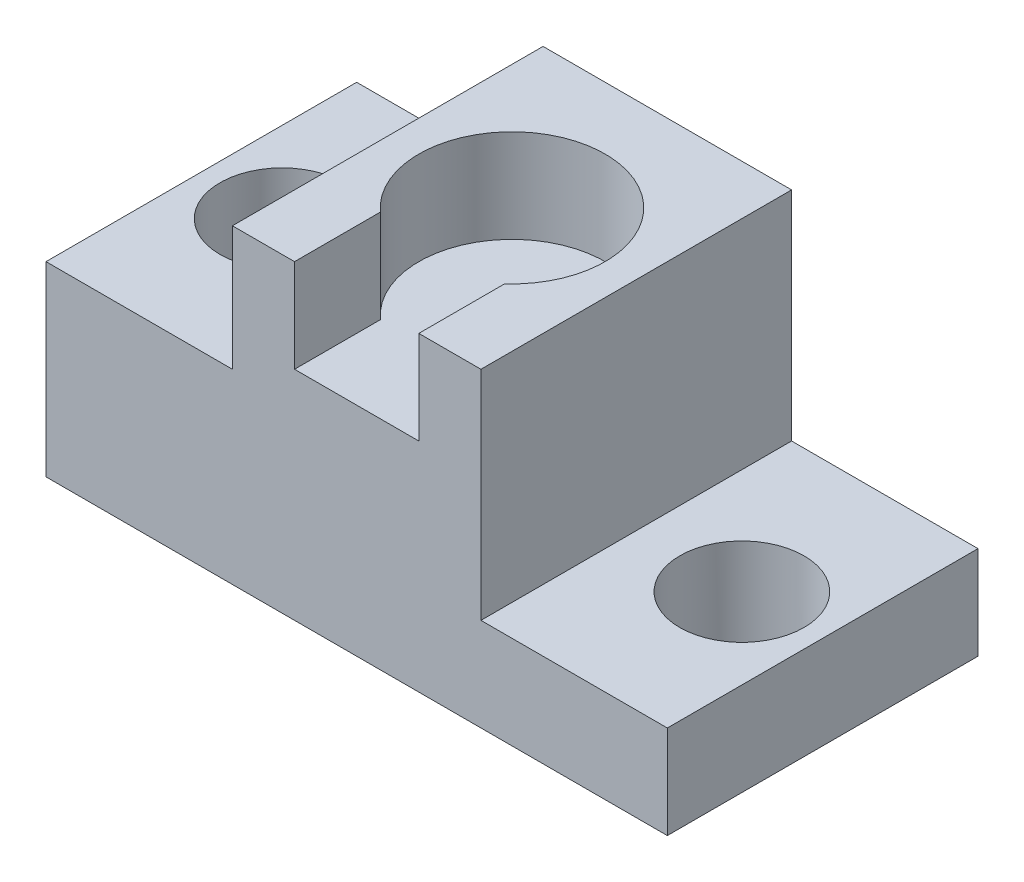
ISO-10303-21;
HEADER;
FILE_DESCRIPTION(('STEP AP214'),'2;1');
FILE_NAME('part.step','',(''),(''),'','','');
FILE_SCHEMA(('AUTOMOTIVE_DESIGN { 1 0 10303 214 1 1 1 1 }'));
ENDSEC;
DATA;
#1=APPLICATION_CONTEXT('core data for automotive mechanical design processes');
#2=APPLICATION_PROTOCOL_DEFINITION('international standard','automotive_design',2000,#1);
#3=PRODUCT_CONTEXT('',#1,'mechanical');
#4=PRODUCT('Part','Part','',(#3));
#5=PRODUCT_RELATED_PRODUCT_CATEGORY('part','',(#4));
#6=PRODUCT_DEFINITION_FORMATION('','',#4);
#7=PRODUCT_DEFINITION_CONTEXT('part definition',#1,'design');
#8=PRODUCT_DEFINITION('design','',#6,#7);
#9=PRODUCT_DEFINITION_SHAPE('','',#8);
#10=(LENGTH_UNIT() NAMED_UNIT(*) SI_UNIT(.MILLI.,.METRE.));
#11=(NAMED_UNIT(*) PLANE_ANGLE_UNIT() SI_UNIT($,.RADIAN.));
#12=(NAMED_UNIT(*) SI_UNIT($,.STERADIAN.) SOLID_ANGLE_UNIT());
#13=UNCERTAINTY_MEASURE_WITH_UNIT(LENGTH_MEASURE(1.E-05),#10,'distance_accuracy_value','');
#14=(GEOMETRIC_REPRESENTATION_CONTEXT(3) GLOBAL_UNCERTAINTY_ASSIGNED_CONTEXT((#13)) GLOBAL_UNIT_ASSIGNED_CONTEXT((#10,
#11,#12)) REPRESENTATION_CONTEXT('',''));
#15=CARTESIAN_POINT('',(0.,0.,0.));
#16=DIRECTION('',(0.,0.,1.));
#17=DIRECTION('',(1.,0.,0.));
#18=AXIS2_PLACEMENT_3D('',#15,#16,#17);
#19=CARTESIAN_POINT('',(-50.,0.,50.));
#20=DIRECTION('',(1.,0.,0.));
#21=DIRECTION('',(0.,1.,0.));
#22=AXIS2_PLACEMENT_3D('',#19,#20,#21);
#23=PLANE('',#22);
#24=DIRECTION('',(0.,-1.,0.));
#25=VECTOR('',#24,1.);
#26=CARTESIAN_POINT('',(-50.,0.,0.));
#27=LINE('',#26,#25);
#28=CARTESIAN_POINT('',(-50.,30.,0.));
#29=VERTEX_POINT('',#28);
#30=CARTESIAN_POINT('',(-50.,0.,0.));
#31=VERTEX_POINT('',#30);
#32=EDGE_CURVE('E150',#29,#31,#27,.T.);
#33=ORIENTED_EDGE('',*,*,#32,.T.);
#34=DIRECTION('',(0.,0.,-1.));
#35=VECTOR('',#34,1.);
#36=CARTESIAN_POINT('',(-50.,0.,50.));
#37=LINE('',#36,#35);
#38=CARTESIAN_POINT('',(-50.,0.,50.));
#39=VERTEX_POINT('',#38);
#40=EDGE_CURVE('E11',#39,#31,#37,.T.);
#41=ORIENTED_EDGE('',*,*,#40,.F.);
#42=DIRECTION('',(0.,-1.,0.));
#43=VECTOR('',#42,1.);
#44=CARTESIAN_POINT('',(-50.,0.,50.));
#45=LINE('',#44,#43);
#46=CARTESIAN_POINT('',(-50.,30.,50.));
#47=VERTEX_POINT('',#46);
#48=EDGE_CURVE('E165',#47,#39,#45,.T.);
#49=ORIENTED_EDGE('',*,*,#48,.F.);
#50=DIRECTION('',(0.,0.,-1.));
#51=VECTOR('',#50,1.);
#52=CARTESIAN_POINT('',(-50.,30.,50.));
#53=LINE('',#52,#51);
#54=EDGE_CURVE('E146',#47,#29,#53,.T.);
#55=ORIENTED_EDGE('',*,*,#54,.T.);
#56=EDGE_LOOP('',(#33,#41,#49,#55));
#57=FACE_BOUND('',#56,.T.);
#58=ADVANCED_FACE('F33',(#57),#23,.F.);
#59=CARTESIAN_POINT('',(-50.,0.,50.));
#60=DIRECTION('',(0.,1.,0.));
#61=DIRECTION('',(0.,0.,1.));
#62=AXIS2_PLACEMENT_3D('',#59,#60,#61);
#63=PLANE('',#62);
#64=CARTESIAN_POINT('',(-37.,0.,25.));
#65=DIRECTION('',(0.,1.,0.));
#66=DIRECTION('',(0.,0.,1.));
#67=AXIS2_PLACEMENT_3D('',#64,#65,#66);
#68=CIRCLE('',#67,10.);
#69=CARTESIAN_POINT('',(-37.,0.,35.));
#70=VERTEX_POINT('',#69);
#71=EDGE_CURVE('E178',#70,#70,#68,.T.);
#72=ORIENTED_EDGE('',*,*,#71,.T.);
#73=EDGE_LOOP('',(#72));
#74=FACE_BOUND('',#73,.T.);
#75=CARTESIAN_POINT('',(37.,0.,25.));
#76=DIRECTION('',(0.,1.,0.));
#77=DIRECTION('',(0.,0.,1.));
#78=AXIS2_PLACEMENT_3D('',#75,#76,#77);
#79=CIRCLE('',#78,10.0004320363604);
#80=CARTESIAN_POINT('',(37.,0.,35.0004320363604));
#81=VERTEX_POINT('',#80);
#82=EDGE_CURVE('E183',#81,#81,#79,.T.);
#83=ORIENTED_EDGE('',*,*,#82,.T.);
#84=EDGE_LOOP('',(#83));
#85=FACE_BOUND('',#84,.T.);
#86=DIRECTION('',(1.,0.,0.));
#87=VECTOR('',#86,1.);
#88=CARTESIAN_POINT('',(-50.,0.,0.));
#89=LINE('',#88,#87);
#90=CARTESIAN_POINT('',(50.,0.,0.));
#91=VERTEX_POINT('',#90);
#92=EDGE_CURVE('E153',#31,#91,#89,.T.);
#93=ORIENTED_EDGE('',*,*,#92,.T.);
#94=DIRECTION('',(0.,0.,-1.));
#95=VECTOR('',#94,1.);
#96=CARTESIAN_POINT('',(50.,0.,50.));
#97=LINE('',#96,#95);
#98=CARTESIAN_POINT('',(50.,0.,50.));
#99=VERTEX_POINT('',#98);
#100=EDGE_CURVE('E41',#99,#91,#97,.T.);
#101=ORIENTED_EDGE('',*,*,#100,.F.);
#102=DIRECTION('',(1.,0.,0.));
#103=VECTOR('',#102,1.);
#104=CARTESIAN_POINT('',(-50.,0.,50.));
#105=LINE('',#104,#103);
#106=EDGE_CURVE('E99',#39,#99,#105,.T.);
#107=ORIENTED_EDGE('',*,*,#106,.F.);
#108=ORIENTED_EDGE('',*,*,#40,.T.);
#109=EDGE_LOOP('',(#93,#101,#107,#108));
#110=FACE_BOUND('',#109,.T.);
#111=ADVANCED_FACE('F260',(#74,#85,#110),#63,.F.);
#112=CARTESIAN_POINT('',(50.,15.,50.));
#113=DIRECTION('',(-1.,0.,0.));
#114=DIRECTION('',(0.,0.,1.));
#115=AXIS2_PLACEMENT_3D('',#112,#113,#114);
#116=PLANE('',#115);
#117=DIRECTION('',(0.,1.,0.));
#118=VECTOR('',#117,1.);
#119=CARTESIAN_POINT('',(50.,15.,0.));
#120=LINE('',#119,#118);
#121=CARTESIAN_POINT('',(50.,15.,0.));
#122=VERTEX_POINT('',#121);
#123=EDGE_CURVE('E155',#91,#122,#120,.T.);
#124=ORIENTED_EDGE('',*,*,#123,.T.);
#125=DIRECTION('',(0.,0.,-1.));
#126=VECTOR('',#125,1.);
#127=CARTESIAN_POINT('',(50.,15.,50.));
#128=LINE('',#127,#126);
#129=CARTESIAN_POINT('',(50.,15.,50.));
#130=VERTEX_POINT('',#129);
#131=EDGE_CURVE('E172',#130,#122,#128,.T.);
#132=ORIENTED_EDGE('',*,*,#131,.F.);
#133=DIRECTION('',(0.,1.,0.));
#134=VECTOR('',#133,1.);
#135=CARTESIAN_POINT('',(50.,15.,50.));
#136=LINE('',#135,#134);
#137=EDGE_CURVE('E196',#99,#130,#136,.T.);
#138=ORIENTED_EDGE('',*,*,#137,.F.);
#139=ORIENTED_EDGE('',*,*,#100,.T.);
#140=EDGE_LOOP('',(#124,#132,#138,#139));
#141=FACE_BOUND('',#140,.T.);
#142=ADVANCED_FACE('F265',(#141),#116,.F.);
#143=CARTESIAN_POINT('',(20.,15.,50.));
#144=DIRECTION('',(0.,-1.,0.));
#145=DIRECTION('',(0.,0.,-1.));
#146=AXIS2_PLACEMENT_3D('',#143,#144,#145);
#147=PLANE('',#146);
#148=CARTESIAN_POINT('',(37.,15.,25.));
#149=DIRECTION('',(0.,-1.,0.));
#150=DIRECTION('',(0.,0.,-1.));
#151=AXIS2_PLACEMENT_3D('',#148,#149,#150);
#152=CIRCLE('',#151,10.0004320363604);
#153=CARTESIAN_POINT('',(37.,15.,14.9995679636396));
#154=VERTEX_POINT('',#153);
#155=EDGE_CURVE('E36',#154,#154,#152,.T.);
#156=ORIENTED_EDGE('',*,*,#155,.T.);
#157=EDGE_LOOP('',(#156));
#158=FACE_BOUND('',#157,.T.);
#159=DIRECTION('',(-1.,0.,0.));
#160=VECTOR('',#159,1.);
#161=CARTESIAN_POINT('',(20.,15.,0.));
#162=LINE('',#161,#160);
#163=CARTESIAN_POINT('',(20.,15.,0.));
#164=VERTEX_POINT('',#163);
#165=EDGE_CURVE('E157',#122,#164,#162,.T.);
#166=ORIENTED_EDGE('',*,*,#165,.T.);
#167=DIRECTION('',(0.,0.,-1.));
#168=VECTOR('',#167,1.);
#169=CARTESIAN_POINT('',(20.,15.,50.));
#170=LINE('',#169,#168);
#171=CARTESIAN_POINT('',(20.,15.,50.));
#172=VERTEX_POINT('',#171);
#173=EDGE_CURVE('E169',#172,#164,#170,.T.);
#174=ORIENTED_EDGE('',*,*,#173,.F.);
#175=DIRECTION('',(-1.,0.,0.));
#176=VECTOR('',#175,1.);
#177=CARTESIAN_POINT('',(20.,15.,50.));
#178=LINE('',#177,#176);
#179=EDGE_CURVE('E198',#130,#172,#178,.T.);
#180=ORIENTED_EDGE('',*,*,#179,.F.);
#181=ORIENTED_EDGE('',*,*,#131,.T.);
#182=EDGE_LOOP('',(#166,#174,#180,#181));
#183=FACE_BOUND('',#182,.T.);
#184=ADVANCED_FACE('F277',(#158,#183),#147,.F.);
#185=CARTESIAN_POINT('',(20.,50.,50.));
#186=DIRECTION('',(-1.,0.,0.));
#187=DIRECTION('',(0.,0.,1.));
#188=AXIS2_PLACEMENT_3D('',#185,#186,#187);
#189=PLANE('',#188);
#190=DIRECTION('',(0.,1.,0.));
#191=VECTOR('',#190,1.);
#192=CARTESIAN_POINT('',(20.,50.,0.));
#193=LINE('',#192,#191);
#194=CARTESIAN_POINT('',(20.,50.,0.));
#195=VERTEX_POINT('',#194);
#196=EDGE_CURVE('E159',#164,#195,#193,.T.);
#197=ORIENTED_EDGE('',*,*,#196,.T.);
#198=DIRECTION('',(0.,0.,-1.));
#199=VECTOR('',#198,1.);
#200=CARTESIAN_POINT('',(20.,50.,50.));
#201=LINE('',#200,#199);
#202=CARTESIAN_POINT('',(20.,50.,50.));
#203=VERTEX_POINT('',#202);
#204=EDGE_CURVE('E141',#203,#195,#201,.T.);
#205=ORIENTED_EDGE('',*,*,#204,.F.);
#206=DIRECTION('',(0.,1.,0.));
#207=VECTOR('',#206,1.);
#208=CARTESIAN_POINT('',(20.,50.,50.));
#209=LINE('',#208,#207);
#210=EDGE_CURVE('E130',#172,#203,#209,.T.);
#211=ORIENTED_EDGE('',*,*,#210,.F.);
#212=ORIENTED_EDGE('',*,*,#173,.T.);
#213=EDGE_LOOP('',(#197,#205,#211,#212));
#214=FACE_BOUND('',#213,.T.);
#215=ADVANCED_FACE('F207',(#214),#189,.F.);
#216=CARTESIAN_POINT('',(-20.,50.,50.));
#217=DIRECTION('',(0.,-1.,0.));
#218=DIRECTION('',(0.,0.,-1.));
#219=AXIS2_PLACEMENT_3D('',#216,#217,#218);
#220=PLANE('',#219);
#221=CARTESIAN_POINT('',(0.,50.,25.));
#222=DIRECTION('',(0.,1.,0.));
#223=DIRECTION('',(0.,0.,1.));
#224=AXIS2_PLACEMENT_3D('',#221,#222,#223);
#225=CIRCLE('',#224,15.);
#226=CARTESIAN_POINT('',(10.,50.,36.180339887499));
#227=VERTEX_POINT('',#226);
#228=CARTESIAN_POINT('',(-10.,50.,36.1803398874989));
#229=VERTEX_POINT('',#228);
#230=EDGE_CURVE('E191',#227,#229,#225,.T.);
#231=ORIENTED_EDGE('',*,*,#230,.F.);
#232=DIRECTION('',(0.,0.,-1.));
#233=VECTOR('',#232,1.);
#234=CARTESIAN_POINT('',(10.,50.,50.));
#235=LINE('',#234,#233);
#236=CARTESIAN_POINT('',(10.,50.,50.));
#237=VERTEX_POINT('',#236);
#238=EDGE_CURVE('E211',#237,#227,#235,.T.);
#239=ORIENTED_EDGE('',*,*,#238,.F.);
#240=DIRECTION('',(-1.,0.,0.));
#241=VECTOR('',#240,1.);
#242=CARTESIAN_POINT('',(-20.,50.,50.));
#243=LINE('',#242,#241);
#244=EDGE_CURVE('E129',#203,#237,#243,.T.);
#245=ORIENTED_EDGE('',*,*,#244,.F.);
#246=ORIENTED_EDGE('',*,*,#204,.T.);
#247=DIRECTION('',(-1.,0.,0.));
#248=VECTOR('',#247,1.);
#249=CARTESIAN_POINT('',(-20.,50.,0.));
#250=LINE('',#249,#248);
#251=CARTESIAN_POINT('',(-20.,50.,0.));
#252=VERTEX_POINT('',#251);
#253=EDGE_CURVE('E138',#195,#252,#250,.T.);
#254=ORIENTED_EDGE('',*,*,#253,.T.);
#255=DIRECTION('',(0.,0.,-1.));
#256=VECTOR('',#255,1.);
#257=CARTESIAN_POINT('',(-20.,50.,50.));
#258=LINE('',#257,#256);
#259=CARTESIAN_POINT('',(-20.,50.,50.));
#260=VERTEX_POINT('',#259);
#261=EDGE_CURVE('E133',#260,#252,#258,.T.);
#262=ORIENTED_EDGE('',*,*,#261,.F.);
#263=CARTESIAN_POINT('',(-9.99999999999999,50.,50.));
#264=VERTEX_POINT('',#263);
#265=EDGE_CURVE('E116',#264,#260,#243,.T.);
#266=ORIENTED_EDGE('',*,*,#265,.F.);
#267=DIRECTION('',(0.,0.,1.));
#268=VECTOR('',#267,1.);
#269=CARTESIAN_POINT('',(-10.,50.,36.1803398874989));
#270=LINE('',#269,#268);
#271=EDGE_CURVE('E217',#229,#264,#270,.T.);
#272=ORIENTED_EDGE('',*,*,#271,.F.);
#273=EDGE_LOOP('',(#231,#239,#245,#246,#254,#262,#266,#272));
#274=FACE_BOUND('',#273,.T.);
#275=ADVANCED_FACE('F135',(#274),#220,.F.);
#276=CARTESIAN_POINT('',(-20.,30.,50.));
#277=DIRECTION('',(1.,0.,0.));
#278=DIRECTION('',(0.,0.,-1.));
#279=AXIS2_PLACEMENT_3D('',#276,#277,#278);
#280=PLANE('',#279);
#281=DIRECTION('',(0.,-1.,0.));
#282=VECTOR('',#281,1.);
#283=CARTESIAN_POINT('',(-20.,30.,0.));
#284=LINE('',#283,#282);
#285=CARTESIAN_POINT('',(-20.,30.,0.));
#286=VERTEX_POINT('',#285);
#287=EDGE_CURVE('E162',#252,#286,#284,.T.);
#288=ORIENTED_EDGE('',*,*,#287,.T.);
#289=DIRECTION('',(0.,0.,-1.));
#290=VECTOR('',#289,1.);
#291=CARTESIAN_POINT('',(-20.,30.,50.));
#292=LINE('',#291,#290);
#293=CARTESIAN_POINT('',(-20.,30.,50.));
#294=VERTEX_POINT('',#293);
#295=EDGE_CURVE('E142',#294,#286,#292,.T.);
#296=ORIENTED_EDGE('',*,*,#295,.F.);
#297=DIRECTION('',(0.,-1.,0.));
#298=VECTOR('',#297,1.);
#299=CARTESIAN_POINT('',(-20.,30.,50.));
#300=LINE('',#299,#298);
#301=EDGE_CURVE('E121',#260,#294,#300,.T.);
#302=ORIENTED_EDGE('',*,*,#301,.F.);
#303=ORIENTED_EDGE('',*,*,#261,.T.);
#304=EDGE_LOOP('',(#288,#296,#302,#303));
#305=FACE_BOUND('',#304,.T.);
#306=ADVANCED_FACE('F144',(#305),#280,.F.);
#307=CARTESIAN_POINT('',(-50.,30.,50.));
#308=DIRECTION('',(0.,-1.,0.));
#309=DIRECTION('',(1.,0.,0.));
#310=AXIS2_PLACEMENT_3D('',#307,#308,#309);
#311=PLANE('',#310);
#312=CARTESIAN_POINT('',(-37.,30.,25.));
#313=DIRECTION('',(0.,-1.,0.));
#314=DIRECTION('',(1.,0.,0.));
#315=AXIS2_PLACEMENT_3D('',#312,#313,#314);
#316=CIRCLE('',#315,10.);
#317=CARTESIAN_POINT('',(-27.,30.,25.));
#318=VERTEX_POINT('',#317);
#319=EDGE_CURVE('E176',#318,#318,#316,.T.);
#320=ORIENTED_EDGE('',*,*,#319,.T.);
#321=EDGE_LOOP('',(#320));
#322=FACE_BOUND('',#321,.T.);
#323=DIRECTION('',(-1.,0.,0.));
#324=VECTOR('',#323,1.);
#325=CARTESIAN_POINT('',(-50.,30.,0.));
#326=LINE('',#325,#324);
#327=EDGE_CURVE('E91',#286,#29,#326,.T.);
#328=ORIENTED_EDGE('',*,*,#327,.T.);
#329=ORIENTED_EDGE('',*,*,#54,.F.);
#330=DIRECTION('',(-1.,0.,0.));
#331=VECTOR('',#330,1.);
#332=CARTESIAN_POINT('',(-50.,30.,50.));
#333=LINE('',#332,#331);
#334=EDGE_CURVE('E58',#294,#47,#333,.T.);
#335=ORIENTED_EDGE('',*,*,#334,.F.);
#336=ORIENTED_EDGE('',*,*,#295,.T.);
#337=EDGE_LOOP('',(#328,#329,#335,#336));
#338=FACE_BOUND('',#337,.T.);
#339=ADVANCED_FACE('F278',(#322,#338),#311,.F.);
#340=CARTESIAN_POINT('',(0.,0.,50.));
#341=DIRECTION('',(0.,0.,-1.));
#342=DIRECTION('',(-1.,0.,0.));
#343=AXIS2_PLACEMENT_3D('',#340,#341,#342);
#344=PLANE('',#343);
#345=ORIENTED_EDGE('',*,*,#244,.T.);
#346=DIRECTION('',(0.,1.,0.));
#347=VECTOR('',#346,1.);
#348=CARTESIAN_POINT('',(10.,35.,50.));
#349=LINE('',#348,#347);
#350=CARTESIAN_POINT('',(10.,35.,50.));
#351=VERTEX_POINT('',#350);
#352=EDGE_CURVE('E228',#351,#237,#349,.T.);
#353=ORIENTED_EDGE('',*,*,#352,.F.);
#354=DIRECTION('',(1.,0.,0.));
#355=VECTOR('',#354,1.);
#356=CARTESIAN_POINT('',(-9.99999999999999,35.,50.));
#357=LINE('',#356,#355);
#358=CARTESIAN_POINT('',(-9.99999999999999,35.,50.));
#359=VERTEX_POINT('',#358);
#360=EDGE_CURVE('E220',#359,#351,#357,.T.);
#361=ORIENTED_EDGE('',*,*,#360,.F.);
#362=DIRECTION('',(0.,1.,0.));
#363=VECTOR('',#362,1.);
#364=CARTESIAN_POINT('',(-9.99999999999999,35.,50.));
#365=LINE('',#364,#363);
#366=EDGE_CURVE('E126',#359,#264,#365,.T.);
#367=ORIENTED_EDGE('',*,*,#366,.T.);
#368=ORIENTED_EDGE('',*,*,#265,.T.);
#369=ORIENTED_EDGE('',*,*,#301,.T.);
#370=ORIENTED_EDGE('',*,*,#334,.T.);
#371=ORIENTED_EDGE('',*,*,#48,.T.);
#372=ORIENTED_EDGE('',*,*,#106,.T.);
#373=ORIENTED_EDGE('',*,*,#137,.T.);
#374=ORIENTED_EDGE('',*,*,#179,.T.);
#375=ORIENTED_EDGE('',*,*,#210,.T.);
#376=EDGE_LOOP('',(#345,#353,#361,#367,#368,#369,#370,#371,#372,#373,#374,#375));
#377=FACE_BOUND('',#376,.T.);
#378=ADVANCED_FACE('F119',(#377),#344,.F.);
#379=CARTESIAN_POINT('',(0.,0.,0.));
#380=DIRECTION('',(0.,0.,-1.));
#381=DIRECTION('',(-1.,0.,0.));
#382=AXIS2_PLACEMENT_3D('',#379,#380,#381);
#383=PLANE('',#382);
#384=ORIENTED_EDGE('',*,*,#32,.F.);
#385=ORIENTED_EDGE('',*,*,#327,.F.);
#386=ORIENTED_EDGE('',*,*,#287,.F.);
#387=ORIENTED_EDGE('',*,*,#253,.F.);
#388=ORIENTED_EDGE('',*,*,#196,.F.);
#389=ORIENTED_EDGE('',*,*,#165,.F.);
#390=ORIENTED_EDGE('',*,*,#123,.F.);
#391=ORIENTED_EDGE('',*,*,#92,.F.);
#392=EDGE_LOOP('',(#384,#385,#386,#387,#388,#389,#390,#391));
#393=FACE_BOUND('',#392,.T.);
#394=ADVANCED_FACE('F270',(#393),#383,.T.);
#395=CARTESIAN_POINT('',(-37.,0.,25.));
#396=DIRECTION('',(0.,1.,0.));
#397=DIRECTION('',(0.,0.,1.));
#398=AXIS2_PLACEMENT_3D('',#395,#396,#397);
#399=CYLINDRICAL_SURFACE('',#398,10.);
#400=ORIENTED_EDGE('',*,*,#71,.F.);
#401=EDGE_LOOP('',(#400));
#402=FACE_BOUND('',#401,.T.);
#403=ORIENTED_EDGE('',*,*,#319,.F.);
#404=EDGE_LOOP('',(#403));
#405=FACE_BOUND('',#404,.T.);
#406=ADVANCED_FACE('F328',(#402,#405),#399,.F.);
#407=CARTESIAN_POINT('',(37.,0.,25.));
#408=DIRECTION('',(0.,1.,0.));
#409=DIRECTION('',(0.,0.,1.));
#410=AXIS2_PLACEMENT_3D('',#407,#408,#409);
#411=CYLINDRICAL_SURFACE('',#410,10.0004320363604);
#412=ORIENTED_EDGE('',*,*,#82,.F.);
#413=EDGE_LOOP('',(#412));
#414=FACE_BOUND('',#413,.T.);
#415=ORIENTED_EDGE('',*,*,#155,.F.);
#416=EDGE_LOOP('',(#415));
#417=FACE_BOUND('',#416,.T.);
#418=ADVANCED_FACE('F355',(#414,#417),#411,.F.);
#419=CARTESIAN_POINT('',(0.,35.,25.));
#420=DIRECTION('',(0.,1.,0.));
#421=DIRECTION('',(0.,0.,1.));
#422=AXIS2_PLACEMENT_3D('',#419,#420,#421);
#423=CYLINDRICAL_SURFACE('',#422,15.);
#424=CARTESIAN_POINT('',(0.,35.,25.));
#425=DIRECTION('',(0.,1.,0.));
#426=DIRECTION('',(0.,0.,1.));
#427=AXIS2_PLACEMENT_3D('',#424,#425,#426);
#428=CIRCLE('',#427,15.);
#429=CARTESIAN_POINT('',(10.,35.,36.180339887499));
#430=VERTEX_POINT('',#429);
#431=CARTESIAN_POINT('',(-10.,35.,36.1803398874989));
#432=VERTEX_POINT('',#431);
#433=EDGE_CURVE('E188',#430,#432,#428,.T.);
#434=ORIENTED_EDGE('',*,*,#433,.F.);
#435=DIRECTION('',(0.,1.,0.));
#436=VECTOR('',#435,1.);
#437=CARTESIAN_POINT('',(10.,35.,36.180339887499));
#438=LINE('',#437,#436);
#439=EDGE_CURVE('E226',#430,#227,#438,.T.);
#440=ORIENTED_EDGE('',*,*,#439,.T.);
#441=ORIENTED_EDGE('',*,*,#230,.T.);
#442=DIRECTION('',(0.,1.,0.));
#443=VECTOR('',#442,1.);
#444=CARTESIAN_POINT('',(-10.,35.,36.1803398874989));
#445=LINE('',#444,#443);
#446=EDGE_CURVE('E231',#432,#229,#445,.T.);
#447=ORIENTED_EDGE('',*,*,#446,.F.);
#448=EDGE_LOOP('',(#434,#440,#441,#447));
#449=FACE_BOUND('',#448,.T.);
#450=ADVANCED_FACE('F238',(#449),#423,.F.);
#451=CARTESIAN_POINT('',(0.,35.,25.));
#452=DIRECTION('',(0.,1.,0.));
#453=DIRECTION('',(0.,0.,1.));
#454=AXIS2_PLACEMENT_3D('',#451,#452,#453);
#455=PLANE('',#454);
#456=ORIENTED_EDGE('',*,*,#433,.T.);
#457=DIRECTION('',(0.,0.,1.));
#458=VECTOR('',#457,1.);
#459=CARTESIAN_POINT('',(-10.,35.,36.1803398874989));
#460=LINE('',#459,#458);
#461=EDGE_CURVE('E216',#432,#359,#460,.T.);
#462=ORIENTED_EDGE('',*,*,#461,.T.);
#463=ORIENTED_EDGE('',*,*,#360,.T.);
#464=DIRECTION('',(0.,0.,-1.));
#465=VECTOR('',#464,1.);
#466=CARTESIAN_POINT('',(10.,35.,50.));
#467=LINE('',#466,#465);
#468=EDGE_CURVE('E49',#351,#430,#467,.T.);
#469=ORIENTED_EDGE('',*,*,#468,.T.);
#470=EDGE_LOOP('',(#456,#462,#463,#469));
#471=FACE_BOUND('',#470,.T.);
#472=ADVANCED_FACE('F248',(#471),#455,.T.);
#473=CARTESIAN_POINT('',(10.,35.,50.));
#474=DIRECTION('',(1.,0.,0.));
#475=DIRECTION('',(0.,0.,-1.));
#476=AXIS2_PLACEMENT_3D('',#473,#474,#475);
#477=PLANE('',#476);
#478=ORIENTED_EDGE('',*,*,#238,.T.);
#479=ORIENTED_EDGE('',*,*,#439,.F.);
#480=ORIENTED_EDGE('',*,*,#468,.F.);
#481=ORIENTED_EDGE('',*,*,#352,.T.);
#482=EDGE_LOOP('',(#478,#479,#480,#481));
#483=FACE_BOUND('',#482,.T.);
#484=ADVANCED_FACE('F250',(#483),#477,.F.);
#485=CARTESIAN_POINT('',(-10.,35.,36.1803398874989));
#486=DIRECTION('',(-1.,0.,0.));
#487=DIRECTION('',(0.,0.,1.));
#488=AXIS2_PLACEMENT_3D('',#485,#486,#487);
#489=PLANE('',#488);
#490=ORIENTED_EDGE('',*,*,#271,.T.);
#491=ORIENTED_EDGE('',*,*,#366,.F.);
#492=ORIENTED_EDGE('',*,*,#461,.F.);
#493=ORIENTED_EDGE('',*,*,#446,.T.);
#494=EDGE_LOOP('',(#490,#491,#492,#493));
#495=FACE_BOUND('',#494,.T.);
#496=ADVANCED_FACE('F247',(#495),#489,.F.);
#497=CLOSED_SHELL('',(#58,#111,#142,#184,#215,#275,#306,#339,#378,#394,#406,#418,#450,#472,#484,#496));
#498=MANIFOLD_SOLID_BREP('B2',#497);
#499=ADVANCED_BREP_SHAPE_REPRESENTATION('',(#18,#498),#14);
#500=SHAPE_DEFINITION_REPRESENTATION(#9,#499);
ENDSEC;
END-ISO-10303-21;
